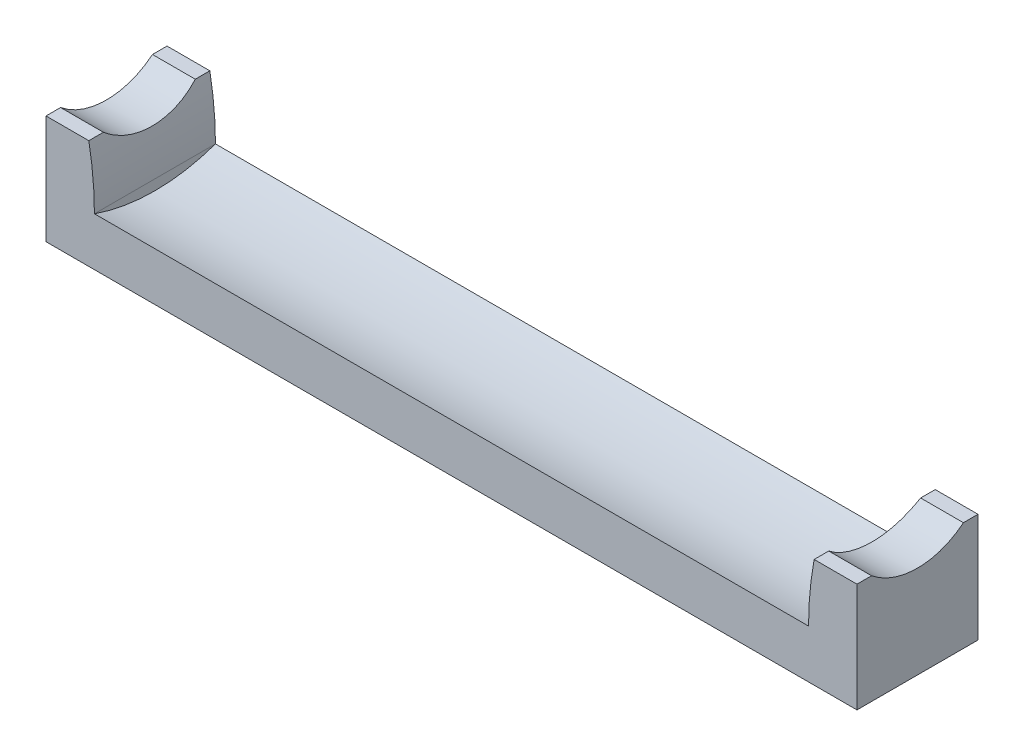
ISO-10303-21;
HEADER;
FILE_DESCRIPTION(('STEP AP214'),'2;1');
FILE_NAME('part.step','',(''),(''),'','','');
FILE_SCHEMA(('AUTOMOTIVE_DESIGN { 1 0 10303 214 1 1 1 1 }'));
ENDSEC;
DATA;
#1=APPLICATION_CONTEXT('core data for automotive mechanical design processes');
#2=APPLICATION_PROTOCOL_DEFINITION('international standard','automotive_design',2000,#1);
#3=PRODUCT_CONTEXT('',#1,'mechanical');
#4=PRODUCT('Part','Part','',(#3));
#5=PRODUCT_RELATED_PRODUCT_CATEGORY('part','',(#4));
#6=PRODUCT_DEFINITION_FORMATION('','',#4);
#7=PRODUCT_DEFINITION_CONTEXT('part definition',#1,'design');
#8=PRODUCT_DEFINITION('design','',#6,#7);
#9=PRODUCT_DEFINITION_SHAPE('','',#8);
#10=(LENGTH_UNIT() NAMED_UNIT(*) SI_UNIT(.MILLI.,.METRE.));
#11=(NAMED_UNIT(*) PLANE_ANGLE_UNIT() SI_UNIT($,.RADIAN.));
#12=(NAMED_UNIT(*) SI_UNIT($,.STERADIAN.) SOLID_ANGLE_UNIT());
#13=UNCERTAINTY_MEASURE_WITH_UNIT(LENGTH_MEASURE(1.E-05),#10,'distance_accuracy_value','');
#14=(GEOMETRIC_REPRESENTATION_CONTEXT(3) GLOBAL_UNCERTAINTY_ASSIGNED_CONTEXT((#13)) GLOBAL_UNIT_ASSIGNED_CONTEXT((#10,
#11,#12)) REPRESENTATION_CONTEXT('',''));
#15=CARTESIAN_POINT('',(0.,0.,0.));
#16=DIRECTION('',(0.,0.,1.));
#17=DIRECTION('',(1.,0.,0.));
#18=AXIS2_PLACEMENT_3D('',#15,#16,#17);
#19=CARTESIAN_POINT('',(126.,18.,20.));
#20=DIRECTION('',(0.,-1.,0.));
#21=DIRECTION('',(0.,0.,-1.));
#22=AXIS2_PLACEMENT_3D('',#19,#20,#21);
#23=PLANE('',#22);
#24=DIRECTION('',(0.,0.,-1.));
#25=VECTOR('',#24,1.);
#26=CARTESIAN_POINT('',(134.,18.,20.));
#27=LINE('',#26,#25);
#28=CARTESIAN_POINT('',(134.,18.,20.));
#29=VERTEX_POINT('',#28);
#30=CARTESIAN_POINT('',(134.,18.,17.5916416133644));
#31=VERTEX_POINT('',#30);
#32=EDGE_CURVE('E161',#29,#31,#27,.T.);
#33=ORIENTED_EDGE('',*,*,#32,.T.);
#34=DIRECTION('',(-1.,0.,0.));
#35=VECTOR('',#34,1.);
#36=CARTESIAN_POINT('',(134.,18.,17.5916416133644));
#37=LINE('',#36,#35);
#38=CARTESIAN_POINT('',(126.926162005538,18.,17.5916416133644));
#39=VERTEX_POINT('',#38);
#40=EDGE_CURVE('E137',#31,#39,#37,.T.);
#41=ORIENTED_EDGE('',*,*,#40,.T.);
#42=DIRECTION('',(0.,0.,-1.));
#43=VECTOR('',#42,1.);
#44=CARTESIAN_POINT('',(126.926162005538,18.,20.));
#45=LINE('',#44,#43);
#46=CARTESIAN_POINT('',(126.926162005538,18.,20.));
#47=VERTEX_POINT('',#46);
#48=EDGE_CURVE('E243',#47,#39,#45,.T.);
#49=ORIENTED_EDGE('',*,*,#48,.F.);
#50=DIRECTION('',(-1.,0.,0.));
#51=VECTOR('',#50,1.);
#52=CARTESIAN_POINT('',(126.,18.,20.));
#53=LINE('',#52,#51);
#54=EDGE_CURVE('E224',#29,#47,#53,.T.);
#55=ORIENTED_EDGE('',*,*,#54,.F.);
#56=EDGE_LOOP('',(#33,#41,#49,#55));
#57=FACE_BOUND('',#56,.T.);
#58=ADVANCED_FACE('F41',(#57),#23,.F.);
#59=CARTESIAN_POINT('',(0.,18.,20.));
#60=DIRECTION('',(0.,-1.,0.));
#61=DIRECTION('',(0.,0.,-1.));
#62=AXIS2_PLACEMENT_3D('',#59,#60,#61);
#63=PLANE('',#62);
#64=DIRECTION('',(0.,0.,-1.));
#65=VECTOR('',#64,1.);
#66=CARTESIAN_POINT('',(7.07383799446221,18.,20.));
#67=LINE('',#66,#65);
#68=CARTESIAN_POINT('',(7.07383799446221,18.,20.));
#69=VERTEX_POINT('',#68);
#70=CARTESIAN_POINT('',(7.07383799446221,18.,17.5916416133644));
#71=VERTEX_POINT('',#70);
#72=EDGE_CURVE('E254',#69,#71,#67,.T.);
#73=ORIENTED_EDGE('',*,*,#72,.T.);
#74=DIRECTION('',(-1.,0.,0.));
#75=VECTOR('',#74,1.);
#76=CARTESIAN_POINT('',(134.,18.,17.5916416133644));
#77=LINE('',#76,#75);
#78=CARTESIAN_POINT('',(0.,18.,17.5916416133644));
#79=VERTEX_POINT('',#78);
#80=EDGE_CURVE('E71',#71,#79,#77,.T.);
#81=ORIENTED_EDGE('',*,*,#80,.T.);
#82=DIRECTION('',(0.,0.,-1.));
#83=VECTOR('',#82,1.);
#84=CARTESIAN_POINT('',(0.,18.,20.));
#85=LINE('',#84,#83);
#86=CARTESIAN_POINT('',(0.,18.,20.));
#87=VERTEX_POINT('',#86);
#88=EDGE_CURVE('E162',#87,#79,#85,.T.);
#89=ORIENTED_EDGE('',*,*,#88,.F.);
#90=DIRECTION('',(-1.,0.,0.));
#91=VECTOR('',#90,1.);
#92=CARTESIAN_POINT('',(0.,18.,20.));
#93=LINE('',#92,#91);
#94=EDGE_CURVE('E214',#69,#87,#93,.T.);
#95=ORIENTED_EDGE('',*,*,#94,.F.);
#96=EDGE_LOOP('',(#73,#81,#89,#95));
#97=FACE_BOUND('',#96,.T.);
#98=ADVANCED_FACE('F296',(#97),#63,.F.);
#99=CARTESIAN_POINT('',(126.,8.00000000000001,20.));
#100=DIRECTION('',(1.,0.,0.));
#101=DIRECTION('',(0.,0.,-1.));
#102=AXIS2_PLACEMENT_3D('',#99,#100,#101);
#103=PLANE('',#102);
#104=DIRECTION('',(0.,0.,-1.));
#105=VECTOR('',#104,1.);
#106=CARTESIAN_POINT('',(126.,8.00000000000001,20.));
#107=LINE('',#106,#105);
#108=CARTESIAN_POINT('',(126.,8.00000000000001,20.));
#109=VERTEX_POINT('',#108);
#110=CARTESIAN_POINT('',(126.,8.00000000000001,0.));
#111=VERTEX_POINT('',#110);
#112=EDGE_CURVE('E238',#109,#111,#107,.T.);
#113=ORIENTED_EDGE('',*,*,#112,.T.);
#114=CARTESIAN_POINT('',(126.,36.284271247462,10.));
#115=DIRECTION('',(1.,0.,0.));
#116=DIRECTION('',(0.,0.,-1.));
#117=AXIS2_PLACEMENT_3D('',#114,#115,#116);
#118=CIRCLE('',#117,30.);
#119=EDGE_CURVE('E185',#109,#111,#118,.T.);
#120=ORIENTED_EDGE('',*,*,#119,.F.);
#121=EDGE_LOOP('',(#113,#120));
#122=FACE_BOUND('',#121,.T.);
#123=ADVANCED_FACE('F302',(#122),#103,.F.);
#124=CARTESIAN_POINT('',(134.,0.,20.));
#125=DIRECTION('',(0.,1.,0.));
#126=DIRECTION('',(-1.,0.,0.));
#127=AXIS2_PLACEMENT_3D('',#124,#125,#126);
#128=PLANE('',#127);
#129=DIRECTION('',(1.,0.,0.));
#130=VECTOR('',#129,1.);
#131=CARTESIAN_POINT('',(134.,0.,0.));
#132=LINE('',#131,#130);
#133=CARTESIAN_POINT('',(0.,0.,0.));
#134=VERTEX_POINT('',#133);
#135=CARTESIAN_POINT('',(134.,0.,0.));
#136=VERTEX_POINT('',#135);
#137=EDGE_CURVE('E179',#134,#136,#132,.T.);
#138=ORIENTED_EDGE('',*,*,#137,.T.);
#139=DIRECTION('',(0.,0.,-1.));
#140=VECTOR('',#139,1.);
#141=CARTESIAN_POINT('',(134.,0.,20.));
#142=LINE('',#141,#140);
#143=CARTESIAN_POINT('',(134.,0.,20.));
#144=VERTEX_POINT('',#143);
#145=EDGE_CURVE('E56',#144,#136,#142,.T.);
#146=ORIENTED_EDGE('',*,*,#145,.F.);
#147=DIRECTION('',(1.,0.,0.));
#148=VECTOR('',#147,1.);
#149=CARTESIAN_POINT('',(134.,0.,20.));
#150=LINE('',#149,#148);
#151=CARTESIAN_POINT('',(0.,0.,20.));
#152=VERTEX_POINT('',#151);
#153=EDGE_CURVE('E210',#152,#144,#150,.T.);
#154=ORIENTED_EDGE('',*,*,#153,.F.);
#155=DIRECTION('',(0.,0.,-1.));
#156=VECTOR('',#155,1.);
#157=CARTESIAN_POINT('',(0.,0.,20.));
#158=LINE('',#157,#156);
#159=EDGE_CURVE('E181',#152,#134,#158,.T.);
#160=ORIENTED_EDGE('',*,*,#159,.T.);
#161=EDGE_LOOP('',(#138,#146,#154,#160));
#162=FACE_BOUND('',#161,.T.);
#163=ADVANCED_FACE('F43',(#162),#128,.F.);
#164=CARTESIAN_POINT('',(134.,18.,20.));
#165=DIRECTION('',(-1.,0.,0.));
#166=DIRECTION('',(0.,-1.,0.));
#167=AXIS2_PLACEMENT_3D('',#164,#165,#166);
#168=PLANE('',#167);
#169=CARTESIAN_POINT('',(134.,18.,2.40835838663563));
#170=VERTEX_POINT('',#169);
#171=CARTESIAN_POINT('',(134.,18.,0.));
#172=VERTEX_POINT('',#171);
#173=EDGE_CURVE('E150',#170,#172,#27,.T.);
#174=ORIENTED_EDGE('',*,*,#173,.F.);
#175=CARTESIAN_POINT('',(134.,27.2537950723972,10.));
#176=DIRECTION('',(-1.,0.,0.));
#177=DIRECTION('',(0.,0.,1.));
#178=AXIS2_PLACEMENT_3D('',#175,#176,#177);
#179=CIRCLE('',#178,11.9693669685447);
#180=EDGE_CURVE('E134',#170,#31,#179,.T.);
#181=ORIENTED_EDGE('',*,*,#180,.T.);
#182=ORIENTED_EDGE('',*,*,#32,.F.);
#183=DIRECTION('',(0.,1.,0.));
#184=VECTOR('',#183,1.);
#185=CARTESIAN_POINT('',(134.,18.,20.));
#186=LINE('',#185,#184);
#187=EDGE_CURVE('E173',#144,#29,#186,.T.);
#188=ORIENTED_EDGE('',*,*,#187,.F.);
#189=ORIENTED_EDGE('',*,*,#145,.T.);
#190=DIRECTION('',(0.,1.,0.));
#191=VECTOR('',#190,1.);
#192=CARTESIAN_POINT('',(134.,18.,0.));
#193=LINE('',#192,#191);
#194=EDGE_CURVE('E158',#136,#172,#193,.T.);
#195=ORIENTED_EDGE('',*,*,#194,.T.);
#196=EDGE_LOOP('',(#174,#181,#182,#188,#189,#195));
#197=FACE_BOUND('',#196,.T.);
#198=ADVANCED_FACE('F156',(#197),#168,.F.);
#199=CARTESIAN_POINT('',(126.926162005538,18.,2.40835838663563));
#200=VERTEX_POINT('',#199);
#201=CARTESIAN_POINT('',(126.926162005538,18.,0.));
#202=VERTEX_POINT('',#201);
#203=EDGE_CURVE('E152',#200,#202,#45,.T.);
#204=ORIENTED_EDGE('',*,*,#203,.F.);
#205=DIRECTION('',(-1.,0.,0.));
#206=VECTOR('',#205,1.);
#207=CARTESIAN_POINT('',(134.,18.,2.40835838663563));
#208=LINE('',#207,#206);
#209=EDGE_CURVE('E63',#200,#170,#208,.F.);
#210=ORIENTED_EDGE('',*,*,#209,.T.);
#211=ORIENTED_EDGE('',*,*,#173,.T.);
#212=DIRECTION('',(-1.,0.,0.));
#213=VECTOR('',#212,1.);
#214=CARTESIAN_POINT('',(126.,18.,0.));
#215=LINE('',#214,#213);
#216=EDGE_CURVE('E189',#172,#202,#215,.T.);
#217=ORIENTED_EDGE('',*,*,#216,.T.);
#218=EDGE_LOOP('',(#204,#210,#211,#217));
#219=FACE_BOUND('',#218,.T.);
#220=ADVANCED_FACE('F148',(#219),#23,.F.);
#221=CARTESIAN_POINT('',(8.,18.,20.));
#222=DIRECTION('',(-1.,0.,0.));
#223=DIRECTION('',(0.,-1.,0.));
#224=AXIS2_PLACEMENT_3D('',#221,#222,#223);
#225=PLANE('',#224);
#226=CARTESIAN_POINT('',(7.99999999999999,36.2842712474619,10.));
#227=DIRECTION('',(1.,0.,0.));
#228=DIRECTION('',(0.,1.,0.));
#229=AXIS2_PLACEMENT_3D('',#226,#227,#228);
#230=CIRCLE('',#229,30.);
#231=CARTESIAN_POINT('',(8.,8.00000000000001,20.));
#232=VERTEX_POINT('',#231);
#233=CARTESIAN_POINT('',(8.,8.00000000000001,0.));
#234=VERTEX_POINT('',#233);
#235=EDGE_CURVE('E192',#232,#234,#230,.T.);
#236=ORIENTED_EDGE('',*,*,#235,.T.);
#237=DIRECTION('',(0.,0.,-1.));
#238=VECTOR('',#237,1.);
#239=CARTESIAN_POINT('',(8.,8.00000000000001,20.));
#240=LINE('',#239,#238);
#241=EDGE_CURVE('E237',#232,#234,#240,.T.);
#242=ORIENTED_EDGE('',*,*,#241,.F.);
#243=EDGE_LOOP('',(#236,#242));
#244=FACE_BOUND('',#243,.T.);
#245=ADVANCED_FACE('F308',(#244),#225,.F.);
#246=CARTESIAN_POINT('',(0.,18.,2.40835838663563));
#247=VERTEX_POINT('',#246);
#248=CARTESIAN_POINT('',(0.,18.,0.));
#249=VERTEX_POINT('',#248);
#250=EDGE_CURVE('E167',#247,#249,#85,.T.);
#251=ORIENTED_EDGE('',*,*,#250,.F.);
#252=DIRECTION('',(-1.,0.,0.));
#253=VECTOR('',#252,1.);
#254=CARTESIAN_POINT('',(134.,18.,2.40835838663563));
#255=LINE('',#254,#253);
#256=CARTESIAN_POINT('',(7.07383799446221,18.,2.40835838663563));
#257=VERTEX_POINT('',#256);
#258=EDGE_CURVE('E143',#247,#257,#255,.F.);
#259=ORIENTED_EDGE('',*,*,#258,.T.);
#260=CARTESIAN_POINT('',(7.07383799446221,18.,0.));
#261=VERTEX_POINT('',#260);
#262=EDGE_CURVE('E258',#257,#261,#67,.T.);
#263=ORIENTED_EDGE('',*,*,#262,.T.);
#264=DIRECTION('',(-1.,0.,0.));
#265=VECTOR('',#264,1.);
#266=CARTESIAN_POINT('',(0.,18.,0.));
#267=LINE('',#266,#265);
#268=EDGE_CURVE('E204',#261,#249,#267,.T.);
#269=ORIENTED_EDGE('',*,*,#268,.T.);
#270=EDGE_LOOP('',(#251,#259,#263,#269));
#271=FACE_BOUND('',#270,.T.);
#272=ADVANCED_FACE('F305',(#271),#63,.F.);
#273=CARTESIAN_POINT('',(0.,0.,20.));
#274=DIRECTION('',(1.,0.,0.));
#275=DIRECTION('',(0.,0.,-1.));
#276=AXIS2_PLACEMENT_3D('',#273,#274,#275);
#277=PLANE('',#276);
#278=ORIENTED_EDGE('',*,*,#88,.T.);
#279=CARTESIAN_POINT('',(0.,27.2537950723972,10.));
#280=DIRECTION('',(-1.,0.,0.));
#281=DIRECTION('',(0.,0.,1.));
#282=AXIS2_PLACEMENT_3D('',#279,#280,#281);
#283=CIRCLE('',#282,11.9693669685447);
#284=EDGE_CURVE('E144',#247,#79,#283,.T.);
#285=ORIENTED_EDGE('',*,*,#284,.F.);
#286=ORIENTED_EDGE('',*,*,#250,.T.);
#287=DIRECTION('',(0.,-1.,0.));
#288=VECTOR('',#287,1.);
#289=CARTESIAN_POINT('',(0.,0.,0.));
#290=LINE('',#289,#288);
#291=EDGE_CURVE('E208',#249,#134,#290,.T.);
#292=ORIENTED_EDGE('',*,*,#291,.T.);
#293=ORIENTED_EDGE('',*,*,#159,.F.);
#294=DIRECTION('',(0.,-1.,0.));
#295=VECTOR('',#294,1.);
#296=CARTESIAN_POINT('',(0.,0.,20.));
#297=LINE('',#296,#295);
#298=EDGE_CURVE('E195',#87,#152,#297,.T.);
#299=ORIENTED_EDGE('',*,*,#298,.F.);
#300=EDGE_LOOP('',(#278,#285,#286,#292,#293,#299));
#301=FACE_BOUND('',#300,.T.);
#302=ADVANCED_FACE('F326',(#301),#277,.F.);
#303=CARTESIAN_POINT('',(0.,0.,20.));
#304=DIRECTION('',(0.,0.,-1.));
#305=DIRECTION('',(-1.,0.,0.));
#306=AXIS2_PLACEMENT_3D('',#303,#304,#305);
#307=PLANE('',#306);
#308=DIRECTION('',(-1.,0.,0.));
#309=VECTOR('',#308,1.);
#310=CARTESIAN_POINT('',(8.,8.00000000000001,20.));
#311=LINE('',#310,#309);
#312=EDGE_CURVE('E218',#109,#232,#311,.T.);
#313=ORIENTED_EDGE('',*,*,#312,.T.);
#314=CARTESIAN_POINT('',(-46.4493163493231,8.00000000000001,20.));
#315=DIRECTION('',(0.,0.,1.));
#316=DIRECTION('',(1.,0.,0.));
#317=AXIS2_PLACEMENT_3D('',#314,#315,#316);
#318=CIRCLE('',#317,54.4493163493232);
#319=EDGE_CURVE('E264',#232,#69,#318,.T.);
#320=ORIENTED_EDGE('',*,*,#319,.T.);
#321=ORIENTED_EDGE('',*,*,#94,.T.);
#322=ORIENTED_EDGE('',*,*,#298,.T.);
#323=ORIENTED_EDGE('',*,*,#153,.T.);
#324=ORIENTED_EDGE('',*,*,#187,.T.);
#325=ORIENTED_EDGE('',*,*,#54,.T.);
#326=CARTESIAN_POINT('',(180.449316349323,8.00000000000001,20.));
#327=DIRECTION('',(0.,0.,1.));
#328=DIRECTION('',(-1.,0.,0.));
#329=AXIS2_PLACEMENT_3D('',#326,#327,#328);
#330=CIRCLE('',#329,54.4493163493232);
#331=EDGE_CURVE('E242',#47,#109,#330,.T.);
#332=ORIENTED_EDGE('',*,*,#331,.T.);
#333=EDGE_LOOP('',(#313,#320,#321,#322,#323,#324,#325,#332));
#334=FACE_BOUND('',#333,.T.);
#335=ADVANCED_FACE('F330',(#334),#307,.F.);
#336=CARTESIAN_POINT('',(0.,0.,0.));
#337=DIRECTION('',(0.,0.,-1.));
#338=DIRECTION('',(-1.,0.,0.));
#339=AXIS2_PLACEMENT_3D('',#336,#337,#338);
#340=PLANE('',#339);
#341=CARTESIAN_POINT('',(-46.4493163493231,8.00000000000001,0.));
#342=DIRECTION('',(0.,0.,1.));
#343=DIRECTION('',(1.,0.,0.));
#344=AXIS2_PLACEMENT_3D('',#341,#342,#343);
#345=CIRCLE('',#344,54.4493163493232);
#346=EDGE_CURVE('E247',#234,#261,#345,.T.);
#347=ORIENTED_EDGE('',*,*,#346,.F.);
#348=DIRECTION('',(-1.,0.,0.));
#349=VECTOR('',#348,1.);
#350=CARTESIAN_POINT('',(8.,8.00000000000001,0.));
#351=LINE('',#350,#349);
#352=EDGE_CURVE('E200',#111,#234,#351,.T.);
#353=ORIENTED_EDGE('',*,*,#352,.F.);
#354=CARTESIAN_POINT('',(180.449316349323,8.00000000000001,0.));
#355=DIRECTION('',(0.,0.,1.));
#356=DIRECTION('',(-1.,0.,0.));
#357=AXIS2_PLACEMENT_3D('',#354,#355,#356);
#358=CIRCLE('',#357,54.4493163493232);
#359=EDGE_CURVE('E248',#202,#111,#358,.T.);
#360=ORIENTED_EDGE('',*,*,#359,.F.);
#361=ORIENTED_EDGE('',*,*,#216,.F.);
#362=ORIENTED_EDGE('',*,*,#194,.F.);
#363=ORIENTED_EDGE('',*,*,#137,.F.);
#364=ORIENTED_EDGE('',*,*,#291,.F.);
#365=ORIENTED_EDGE('',*,*,#268,.F.);
#366=EDGE_LOOP('',(#347,#353,#360,#361,#362,#363,#364,#365));
#367=FACE_BOUND('',#366,.T.);
#368=ADVANCED_FACE('F332',(#367),#340,.T.);
#369=CARTESIAN_POINT('',(146.073458226033,36.284271247462,10.));
#370=DIRECTION('',(-1.,0.,0.));
#371=DIRECTION('',(0.,-1.,0.));
#372=AXIS2_PLACEMENT_3D('',#369,#370,#371);
#373=CYLINDRICAL_SURFACE('',#372,30.);
#374=ORIENTED_EDGE('',*,*,#119,.T.);
#375=ORIENTED_EDGE('',*,*,#352,.T.);
#376=ORIENTED_EDGE('',*,*,#235,.F.);
#377=ORIENTED_EDGE('',*,*,#312,.F.);
#378=EDGE_LOOP('',(#374,#375,#376,#377));
#379=FACE_BOUND('',#378,.T.);
#380=ADVANCED_FACE('F292',(#379),#373,.F.);
#381=CARTESIAN_POINT('',(180.449316349323,8.00000000000001,20.));
#382=DIRECTION('',(0.,0.,-1.));
#383=DIRECTION('',(-1.,0.,0.));
#384=AXIS2_PLACEMENT_3D('',#381,#382,#383);
#385=CYLINDRICAL_SURFACE('',#384,54.4493163493232);
#386=ORIENTED_EDGE('',*,*,#48,.T.);
#387=CARTESIAN_POINT('',(126.926162005538,18.,17.5916416133644));
#388=CARTESIAN_POINT('',(126.886986155446,17.7902888784099,17.3360832448839));
#389=CARTESIAN_POINT('',(126.851021671992,17.5909947293008,17.0714952041341));
#390=CARTESIAN_POINT('',(126.785045351407,17.2147014445908,16.5262383021265));
#391=CARTESIAN_POINT('',(126.755033119407,17.0377008303307,16.2455705091859));
#392=CARTESIAN_POINT('',(126.700507117484,16.7075544775354,15.6703194944732));
#393=CARTESIAN_POINT('',(126.675989136279,16.5543904961909,15.3757471415163));
#394=CARTESIAN_POINT('',(126.631969680884,16.2729413601257,14.7745919196186));
#395=CARTESIAN_POINT('',(126.612468160061,16.1446559741343,14.4680091623579));
#396=CARTESIAN_POINT('',(126.578064189668,15.9139032038409,13.8448718778475));
#397=CARTESIAN_POINT('',(126.563163785395,15.8114473050132,13.5283129846956));
#398=CARTESIAN_POINT('',(126.537626470672,15.6332077053135,12.8876051486725));
#399=CARTESIAN_POINT('',(126.526989570344,15.5574240677678,12.5634561877827));
#400=CARTESIAN_POINT('',(126.509713644538,15.4331186732797,11.909961289796));
#401=CARTESIAN_POINT('',(126.503073511954,15.3845893671344,11.58061681782));
#402=CARTESIAN_POINT('',(126.493610012834,15.3151238314431,10.9189787143701));
#403=CARTESIAN_POINT('',(126.490786622577,15.294187430401,10.5866851012389));
#404=CARTESIAN_POINT('',(126.488877870264,15.280053717328,9.92104366579349));
#405=CARTESIAN_POINT('',(126.489797614494,15.2868942978958,9.58769502367597));
#406=CARTESIAN_POINT('',(126.495412093986,15.3283491890079,8.92275682673414));
#407=CARTESIAN_POINT('',(126.500106878276,15.3629638602653,8.59116729481239));
#408=CARTESIAN_POINT('',(126.513403541218,15.4597415195968,7.93187768172702));
#409=CARTESIAN_POINT('',(126.522008116556,15.5219235208618,7.60418044552643));
#410=CARTESIAN_POINT('',(126.54334908678,15.6733684997732,6.95525536669214));
#411=CARTESIAN_POINT('',(126.55608531201,15.7626303654404,6.63402725899441));
#412=CARTESIAN_POINT('',(126.586018418363,15.9676801317899,5.99993482804233));
#413=CARTESIAN_POINT('',(126.603220684427,16.0835000350799,5.68708110806151));
#414=CARTESIAN_POINT('',(126.642463195953,16.3407142352023,5.0723835992129));
#415=CARTESIAN_POINT('',(126.664503366336,16.4821081351496,4.77053963957094));
#416=CARTESIAN_POINT('',(126.713806989384,16.7890379482888,4.18064021952663));
#417=CARTESIAN_POINT('',(126.741059680398,16.9545239562061,3.89255785263446));
#418=CARTESIAN_POINT('',(126.801274893706,17.3084839203381,3.33168888546026));
#419=CARTESIAN_POINT('',(126.834233721985,17.4969429811398,3.05889253968268));
#420=CARTESIAN_POINT('',(126.879207049803,17.7454582823005,2.72923548437497));
#421=CARTESIAN_POINT('',(126.888331161675,17.7954873181599,2.66427335906732));
#422=CARTESIAN_POINT('',(126.906958581501,17.8967987707551,2.53547948719751));
#423=CARTESIAN_POINT('',(126.916461561199,17.9480800881861,2.4716468284367));
#424=CARTESIAN_POINT('',(126.926162005538,18.,2.40835838663563));
#425=B_SPLINE_CURVE_WITH_KNOTS('',3,(#387,#388,#389,#390,#391,#392,#393,#394,#395,#396,#397,
#398,#399,#400,#401,#402,#403,#404,#405,#406,#407,#408,#409,#410,#411,#412,#413,#414,#415,#416,
#417,#418,#419,#420,#421,#422,#423,#424),.UNSPECIFIED.,.F.,.F.,(4,2,2,2,2,2,2,2,2,2,2,2,2,2,2,2,
2,2,4),(0.,0.998396811836352,1.99672736827643,2.99429007808187,3.99184351412793,
4.98983974817762,5.98783835169118,6.98556038211504,7.9832762114395,8.9823535543468,
9.9814438728773,10.9812243387302,11.9809637562049,12.981914256482,13.9828492242465,
14.9817395659243,15.9799856517399,16.2274748873574,16.4747541667142),.UNSPECIFIED.);
#426=EDGE_CURVE('E154',#39,#200,#425,.T.);
#427=ORIENTED_EDGE('',*,*,#426,.T.);
#428=ORIENTED_EDGE('',*,*,#203,.T.);
#429=ORIENTED_EDGE('',*,*,#359,.T.);
#430=ORIENTED_EDGE('',*,*,#112,.F.);
#431=ORIENTED_EDGE('',*,*,#331,.F.);
#432=EDGE_LOOP('',(#386,#427,#428,#429,#430,#431));
#433=FACE_BOUND('',#432,.T.);
#434=ADVANCED_FACE('F277',(#433),#385,.T.);
#435=CARTESIAN_POINT('',(-46.4493163493231,8.00000000000001,20.));
#436=DIRECTION('',(0.,0.,-1.));
#437=DIRECTION('',(-1.,0.,0.));
#438=AXIS2_PLACEMENT_3D('',#435,#436,#437);
#439=CYLINDRICAL_SURFACE('',#438,54.4493163493232);
#440=ORIENTED_EDGE('',*,*,#262,.F.);
#441=CARTESIAN_POINT('',(7.07383799446221,18.,2.40835838663563));
#442=CARTESIAN_POINT('',(7.11301384455405,17.7902888784099,2.6639167551161));
#443=CARTESIAN_POINT('',(7.14897832800852,17.5909947293008,2.92850479586588));
#444=CARTESIAN_POINT('',(7.21495464859299,17.2147014445908,3.47376169787346));
#445=CARTESIAN_POINT('',(7.24496688059284,17.0377008303307,3.75442949081408));
#446=CARTESIAN_POINT('',(7.29949288251605,16.7075544775354,4.32968050552683));
#447=CARTESIAN_POINT('',(7.32401086372104,16.5543904961909,4.62425285848368));
#448=CARTESIAN_POINT('',(7.3680303191159,16.2729413601257,5.22540808038143));
#449=CARTESIAN_POINT('',(7.38753183993919,16.1446559741343,5.53199083764209));
#450=CARTESIAN_POINT('',(7.4219358103319,15.9139032038409,6.15512812215248));
#451=CARTESIAN_POINT('',(7.43683621460477,15.8114473050132,6.47168701530438));
#452=CARTESIAN_POINT('',(7.46237352932803,15.6332077053135,7.11239485132746));
#453=CARTESIAN_POINT('',(7.47301042965587,15.5574240677678,7.43654381221731));
#454=CARTESIAN_POINT('',(7.49028635546243,15.4331186732797,8.090038710204));
#455=CARTESIAN_POINT('',(7.49692648804624,15.3845893671344,8.41938318218004));
#456=CARTESIAN_POINT('',(7.50638998716569,15.3151238314431,9.08102128562986));
#457=CARTESIAN_POINT('',(7.50921337742327,15.294187430401,9.41331489876113));
#458=CARTESIAN_POINT('',(7.51112212973635,15.280053717328,10.0789563342065));
#459=CARTESIAN_POINT('',(7.51020238550629,15.2868942978958,10.412304976324));
#460=CARTESIAN_POINT('',(7.50458790601393,15.3283491890079,11.0772431732659));
#461=CARTESIAN_POINT('',(7.49989312172368,15.3629638602653,11.4088327051876));
#462=CARTESIAN_POINT('',(7.48659645878173,15.4597415195968,12.068122318273));
#463=CARTESIAN_POINT('',(7.47799188344436,15.5219235208618,12.3958195544736));
#464=CARTESIAN_POINT('',(7.4566509132204,15.6733684997732,13.0447446333079));
#465=CARTESIAN_POINT('',(7.44391468799004,15.7626303654404,13.3659727410056));
#466=CARTESIAN_POINT('',(7.41398158163723,15.9676801317899,14.0000651719577));
#467=CARTESIAN_POINT('',(7.39677931557329,16.0835000350799,14.3129188919385));
#468=CARTESIAN_POINT('',(7.35753680404723,16.3407142352023,14.9276164007871));
#469=CARTESIAN_POINT('',(7.33549663366387,16.4821081351496,15.2294603604291));
#470=CARTESIAN_POINT('',(7.28619301061628,16.7890379482888,15.8193597804734));
#471=CARTESIAN_POINT('',(7.25894031960224,16.9545239562061,16.1074421473655));
#472=CARTESIAN_POINT('',(7.19872510629366,17.3084839203381,16.6683111145397));
#473=CARTESIAN_POINT('',(7.16576627801471,17.4969429811398,16.9411074603173));
#474=CARTESIAN_POINT('',(7.12079295019656,17.7454582823005,17.270764515625));
#475=CARTESIAN_POINT('',(7.11166883832462,17.7954873181599,17.3357266409327));
#476=CARTESIAN_POINT('',(7.0930414184992,17.8967987707551,17.4645205128025));
#477=CARTESIAN_POINT('',(7.08353843880136,17.9480800881861,17.5283531715633));
#478=CARTESIAN_POINT('',(7.07383799446221,18.,17.5916416133644));
#479=B_SPLINE_CURVE_WITH_KNOTS('',3,(#441,#442,#443,#444,#445,#446,#447,#448,#449,#450,#451,
#452,#453,#454,#455,#456,#457,#458,#459,#460,#461,#462,#463,#464,#465,#466,#467,#468,#469,#470,
#471,#472,#473,#474,#475,#476,#477,#478),.UNSPECIFIED.,.F.,.F.,(4,2,2,2,2,2,2,2,2,2,2,2,2,2,2,2,
2,2,4),(0.,0.998396811836353,1.99672736827643,2.99429007808188,3.99184351412793,
4.98983974817762,5.98783835169118,6.98556038211504,7.9832762114395,8.98235355434681,
9.9814438728773,10.9812243387302,11.980963756205,12.981914256482,13.9828492242465,
14.9817395659243,15.9799856517399,16.2274748873574,16.4747541667142),.UNSPECIFIED.);
#480=EDGE_CURVE('E11',#257,#71,#479,.T.);
#481=ORIENTED_EDGE('',*,*,#480,.T.);
#482=ORIENTED_EDGE('',*,*,#72,.F.);
#483=ORIENTED_EDGE('',*,*,#319,.F.);
#484=ORIENTED_EDGE('',*,*,#241,.T.);
#485=ORIENTED_EDGE('',*,*,#346,.T.);
#486=EDGE_LOOP('',(#440,#481,#482,#483,#484,#485));
#487=FACE_BOUND('',#486,.T.);
#488=ADVANCED_FACE('F283',(#487),#439,.T.);
#489=CARTESIAN_POINT('',(134.,27.2537950723972,10.));
#490=DIRECTION('',(-1.,0.,0.));
#491=DIRECTION('',(0.,0.,1.));
#492=AXIS2_PLACEMENT_3D('',#489,#490,#491);
#493=CYLINDRICAL_SURFACE('',#492,11.9693669685447);
#494=ORIENTED_EDGE('',*,*,#480,.F.);
#495=ORIENTED_EDGE('',*,*,#258,.F.);
#496=ORIENTED_EDGE('',*,*,#284,.T.);
#497=ORIENTED_EDGE('',*,*,#80,.F.);
#498=EDGE_LOOP('',(#494,#495,#496,#497));
#499=FACE_BOUND('',#498,.T.);
#500=ADVANCED_FACE('F282',(#499),#493,.F.);
#501=ORIENTED_EDGE('',*,*,#180,.F.);
#502=ORIENTED_EDGE('',*,*,#209,.F.);
#503=ORIENTED_EDGE('',*,*,#426,.F.);
#504=ORIENTED_EDGE('',*,*,#40,.F.);
#505=EDGE_LOOP('',(#501,#502,#503,#504));
#506=FACE_BOUND('',#505,.T.);
#507=ADVANCED_FACE('F135',(#506),#493,.F.);
#508=CLOSED_SHELL('',(#58,#98,#123,#163,#198,#220,#245,#272,#302,#335,#368,#380,#434,#488,#500,#507));
#509=MANIFOLD_SOLID_BREP('B2',#508);
#510=ADVANCED_BREP_SHAPE_REPRESENTATION('',(#18,#509),#14);
#511=SHAPE_DEFINITION_REPRESENTATION(#9,#510);
ENDSEC;
END-ISO-10303-21;
